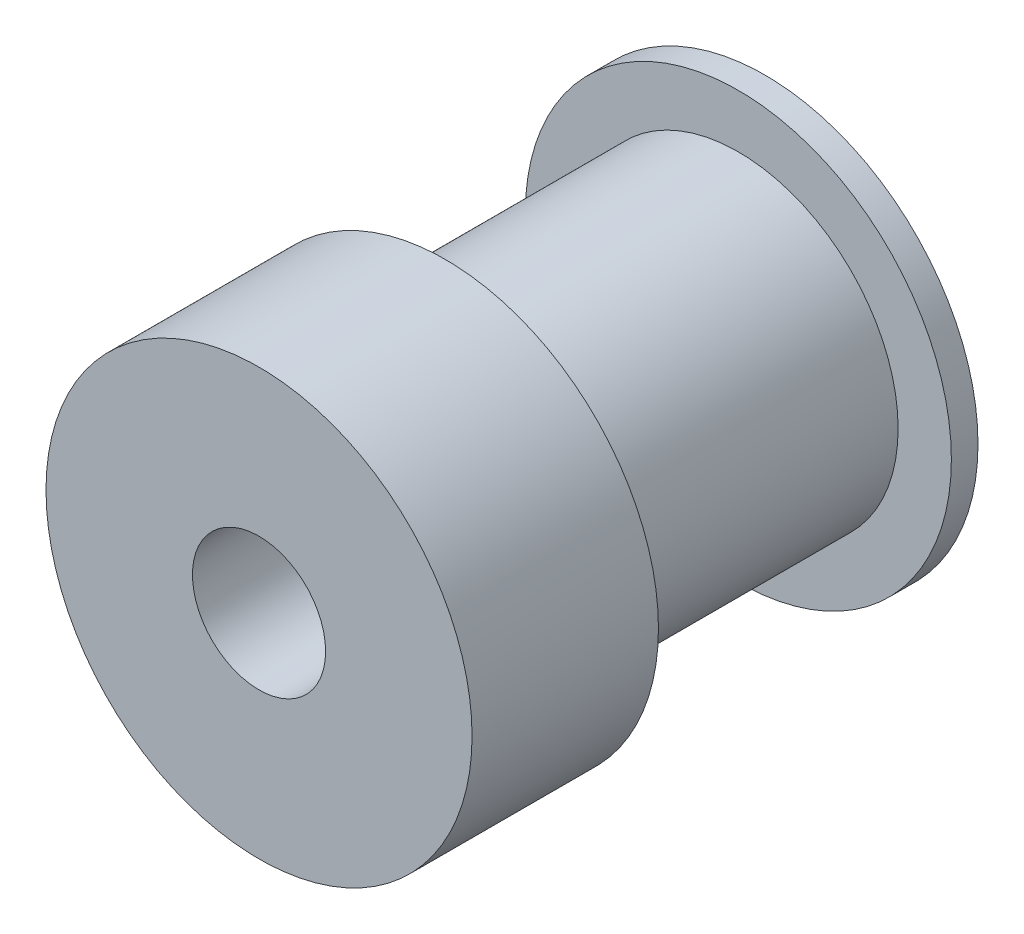
ISO-10303-21;
HEADER;
FILE_DESCRIPTION(('STEP AP214'),'2;1');
FILE_NAME('part.step','',(''),(''),'','','');
FILE_SCHEMA(('AUTOMOTIVE_DESIGN { 1 0 10303 214 1 1 1 1 }'));
ENDSEC;
DATA;
#1=APPLICATION_CONTEXT('core data for automotive mechanical design processes');
#2=APPLICATION_PROTOCOL_DEFINITION('international standard','automotive_design',2000,#1);
#3=PRODUCT_CONTEXT('',#1,'mechanical');
#4=PRODUCT('Part','Part','',(#3));
#5=PRODUCT_RELATED_PRODUCT_CATEGORY('part','',(#4));
#6=PRODUCT_DEFINITION_FORMATION('','',#4);
#7=PRODUCT_DEFINITION_CONTEXT('part definition',#1,'design');
#8=PRODUCT_DEFINITION('design','',#6,#7);
#9=PRODUCT_DEFINITION_SHAPE('','',#8);
#10=(LENGTH_UNIT() NAMED_UNIT(*) SI_UNIT(.MILLI.,.METRE.));
#11=(NAMED_UNIT(*) PLANE_ANGLE_UNIT() SI_UNIT($,.RADIAN.));
#12=(NAMED_UNIT(*) SI_UNIT($,.STERADIAN.) SOLID_ANGLE_UNIT());
#13=UNCERTAINTY_MEASURE_WITH_UNIT(LENGTH_MEASURE(1.E-05),#10,'distance_accuracy_value','');
#14=(GEOMETRIC_REPRESENTATION_CONTEXT(3) GLOBAL_UNCERTAINTY_ASSIGNED_CONTEXT((#13)) GLOBAL_UNIT_ASSIGNED_CONTEXT((#10,
#11,#12)) REPRESENTATION_CONTEXT('',''));
#15=CARTESIAN_POINT('',(0.,0.,0.));
#16=DIRECTION('',(0.,0.,1.));
#17=DIRECTION('',(1.,0.,0.));
#18=AXIS2_PLACEMENT_3D('',#15,#16,#17);
#19=CARTESIAN_POINT('',(0.,0.,19.));
#20=DIRECTION('',(0.,0.,-1.));
#21=DIRECTION('',(-1.,0.,0.));
#22=AXIS2_PLACEMENT_3D('',#19,#20,#21);
#23=CYLINDRICAL_SURFACE('',#22,8.);
#24=CARTESIAN_POINT('',(0.,0.,0.));
#25=DIRECTION('',(0.,0.,1.));
#26=DIRECTION('',(1.,0.,0.));
#27=AXIS2_PLACEMENT_3D('',#24,#25,#26);
#28=CIRCLE('',#27,8.);
#29=CARTESIAN_POINT('',(8.,0.,0.));
#30=VERTEX_POINT('',#29);
#31=EDGE_CURVE('E51',#30,#30,#28,.T.);
#32=ORIENTED_EDGE('',*,*,#31,.T.);
#33=EDGE_LOOP('',(#32));
#34=FACE_BOUND('',#33,.T.);
#35=CARTESIAN_POINT('',(0.,0.,1.));
#36=DIRECTION('',(0.,0.,1.));
#37=DIRECTION('',(1.,0.,0.));
#38=AXIS2_PLACEMENT_3D('',#35,#36,#37);
#39=CIRCLE('',#38,8.);
#40=CARTESIAN_POINT('',(8.,0.,1.));
#41=VERTEX_POINT('',#40);
#42=EDGE_CURVE('E60',#41,#41,#39,.T.);
#43=ORIENTED_EDGE('',*,*,#42,.F.);
#44=EDGE_LOOP('',(#43));
#45=FACE_BOUND('',#44,.T.);
#46=ADVANCED_FACE('F47',(#34,#45),#23,.T.);
#47=CARTESIAN_POINT('',(0.,0.,0.));
#48=DIRECTION('',(0.,0.,1.));
#49=DIRECTION('',(1.,0.,0.));
#50=AXIS2_PLACEMENT_3D('',#47,#48,#49);
#51=PLANE('',#50);
#52=CARTESIAN_POINT('',(0.,0.,0.));
#53=DIRECTION('',(0.,0.,1.));
#54=DIRECTION('',(1.,0.,0.));
#55=AXIS2_PLACEMENT_3D('',#52,#53,#54);
#56=CIRCLE('',#55,2.5);
#57=CARTESIAN_POINT('',(2.5,0.,0.));
#58=VERTEX_POINT('',#57);
#59=EDGE_CURVE('E74',#58,#58,#56,.T.);
#60=ORIENTED_EDGE('',*,*,#59,.T.);
#61=EDGE_LOOP('',(#60));
#62=FACE_BOUND('',#61,.T.);
#63=ORIENTED_EDGE('',*,*,#31,.F.);
#64=EDGE_LOOP('',(#63));
#65=FACE_BOUND('',#64,.T.);
#66=ADVANCED_FACE('F86',(#62,#65),#51,.F.);
#67=CARTESIAN_POINT('',(0.,0.,1.));
#68=DIRECTION('',(0.,0.,1.));
#69=DIRECTION('',(1.,0.,0.));
#70=AXIS2_PLACEMENT_3D('',#67,#68,#69);
#71=PLANE('',#70);
#72=CARTESIAN_POINT('',(0.,0.,1.));
#73=DIRECTION('',(0.,0.,1.));
#74=DIRECTION('',(1.,0.,0.));
#75=AXIS2_PLACEMENT_3D('',#72,#73,#74);
#76=CIRCLE('',#75,6.);
#77=CARTESIAN_POINT('',(6.,0.,1.));
#78=VERTEX_POINT('',#77);
#79=EDGE_CURVE('E66',#78,#78,#76,.T.);
#80=ORIENTED_EDGE('',*,*,#79,.F.);
#81=EDGE_LOOP('',(#80));
#82=FACE_BOUND('',#81,.T.);
#83=ORIENTED_EDGE('',*,*,#42,.T.);
#84=EDGE_LOOP('',(#83));
#85=FACE_BOUND('',#84,.T.);
#86=ADVANCED_FACE('F113',(#82,#85),#71,.T.);
#87=CARTESIAN_POINT('',(0.,0.,12.));
#88=DIRECTION('',(0.,0.,1.));
#89=DIRECTION('',(1.,0.,0.));
#90=AXIS2_PLACEMENT_3D('',#87,#88,#89);
#91=PLANE('',#90);
#92=CARTESIAN_POINT('',(0.,0.,12.));
#93=DIRECTION('',(0.,0.,1.));
#94=DIRECTION('',(1.,0.,0.));
#95=AXIS2_PLACEMENT_3D('',#92,#93,#94);
#96=CIRCLE('',#95,6.);
#97=CARTESIAN_POINT('',(6.,0.,12.));
#98=VERTEX_POINT('',#97);
#99=EDGE_CURVE('E70',#98,#98,#96,.T.);
#100=ORIENTED_EDGE('',*,*,#99,.T.);
#101=EDGE_LOOP('',(#100));
#102=FACE_BOUND('',#101,.T.);
#103=CARTESIAN_POINT('',(0.,0.,12.));
#104=DIRECTION('',(0.,0.,1.));
#105=DIRECTION('',(1.,0.,0.));
#106=AXIS2_PLACEMENT_3D('',#103,#104,#105);
#107=CIRCLE('',#106,8.);
#108=CARTESIAN_POINT('',(8.,0.,12.));
#109=VERTEX_POINT('',#108);
#110=EDGE_CURVE('E62',#109,#109,#107,.T.);
#111=ORIENTED_EDGE('',*,*,#110,.F.);
#112=EDGE_LOOP('',(#111));
#113=FACE_BOUND('',#112,.T.);
#114=ADVANCED_FACE('F104',(#102,#113),#91,.F.);
#115=CARTESIAN_POINT('',(0.,0.,1.));
#116=DIRECTION('',(0.,0.,1.));
#117=DIRECTION('',(1.,0.,0.));
#118=AXIS2_PLACEMENT_3D('',#115,#116,#117);
#119=CYLINDRICAL_SURFACE('',#118,6.);
#120=ORIENTED_EDGE('',*,*,#79,.T.);
#121=EDGE_LOOP('',(#120));
#122=FACE_BOUND('',#121,.T.);
#123=ORIENTED_EDGE('',*,*,#99,.F.);
#124=EDGE_LOOP('',(#123));
#125=FACE_BOUND('',#124,.T.);
#126=ADVANCED_FACE('F97',(#122,#125),#119,.T.);
#127=CARTESIAN_POINT('',(0.,0.,19.));
#128=DIRECTION('',(0.,0.,1.));
#129=DIRECTION('',(1.,0.,0.));
#130=AXIS2_PLACEMENT_3D('',#127,#128,#129);
#131=PLANE('',#130);
#132=CARTESIAN_POINT('',(0.,0.,19.));
#133=DIRECTION('',(0.,0.,1.));
#134=DIRECTION('',(1.,0.,0.));
#135=AXIS2_PLACEMENT_3D('',#132,#133,#134);
#136=CIRCLE('',#135,2.5);
#137=CARTESIAN_POINT('',(2.5,0.,19.));
#138=VERTEX_POINT('',#137);
#139=EDGE_CURVE('E78',#138,#138,#136,.T.);
#140=ORIENTED_EDGE('',*,*,#139,.F.);
#141=EDGE_LOOP('',(#140));
#142=FACE_BOUND('',#141,.T.);
#143=CARTESIAN_POINT('',(0.,0.,19.));
#144=DIRECTION('',(0.,0.,1.));
#145=DIRECTION('',(1.,0.,0.));
#146=AXIS2_PLACEMENT_3D('',#143,#144,#145);
#147=CIRCLE('',#146,8.);
#148=CARTESIAN_POINT('',(8.,0.,19.));
#149=VERTEX_POINT('',#148);
#150=EDGE_CURVE('E11',#149,#149,#147,.T.);
#151=ORIENTED_EDGE('',*,*,#150,.T.);
#152=EDGE_LOOP('',(#151));
#153=FACE_BOUND('',#152,.T.);
#154=ADVANCED_FACE('F95',(#142,#153),#131,.T.);
#155=ORIENTED_EDGE('',*,*,#110,.T.);
#156=EDGE_LOOP('',(#155));
#157=FACE_BOUND('',#156,.T.);
#158=ORIENTED_EDGE('',*,*,#150,.F.);
#159=EDGE_LOOP('',(#158));
#160=FACE_BOUND('',#159,.T.);
#161=ADVANCED_FACE('F49',(#157,#160),#23,.T.);
#162=CARTESIAN_POINT('',(0.,0.,0.));
#163=DIRECTION('',(0.,0.,1.));
#164=DIRECTION('',(1.,0.,0.));
#165=AXIS2_PLACEMENT_3D('',#162,#163,#164);
#166=CYLINDRICAL_SURFACE('',#165,2.5);
#167=ORIENTED_EDGE('',*,*,#59,.F.);
#168=EDGE_LOOP('',(#167));
#169=FACE_BOUND('',#168,.T.);
#170=ORIENTED_EDGE('',*,*,#139,.T.);
#171=EDGE_LOOP('',(#170));
#172=FACE_BOUND('',#171,.T.);
#173=ADVANCED_FACE('F89',(#169,#172),#166,.F.);
#174=CLOSED_SHELL('',(#46,#66,#86,#114,#126,#154,#161,#173));
#175=MANIFOLD_SOLID_BREP('B2',#174);
#176=ADVANCED_BREP_SHAPE_REPRESENTATION('',(#18,#175),#14);
#177=SHAPE_DEFINITION_REPRESENTATION(#9,#176);
ENDSEC;
END-ISO-10303-21;
